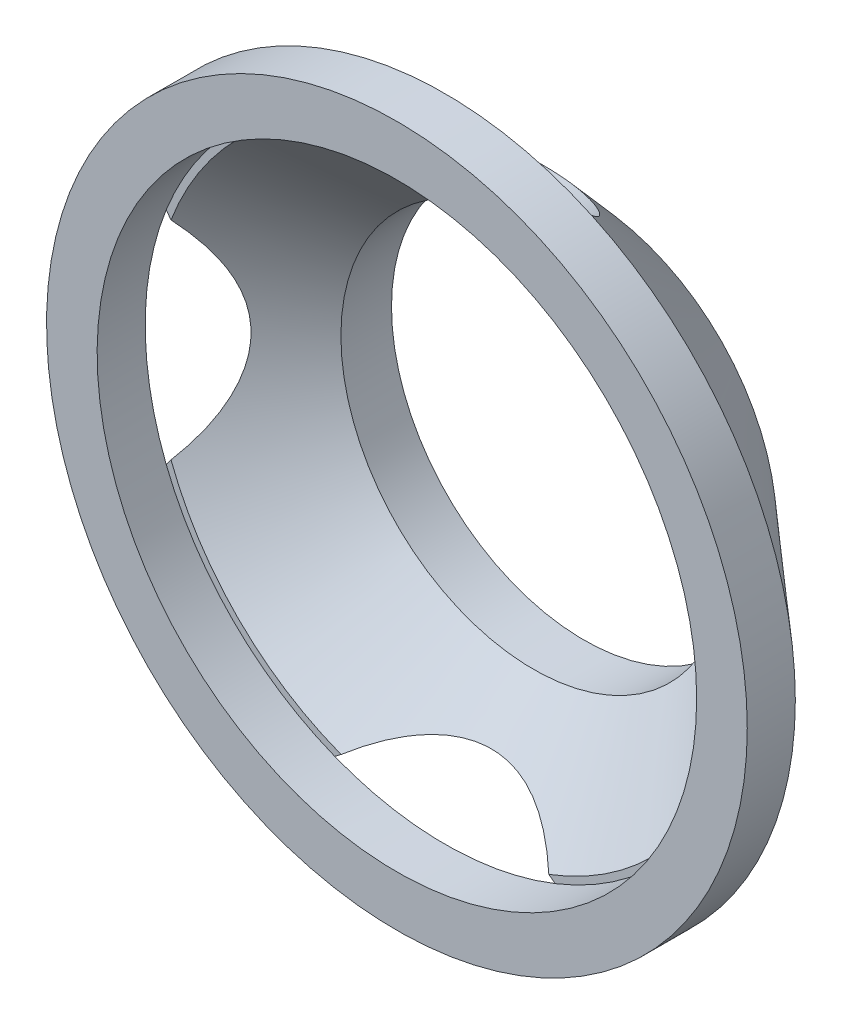
ISO-10303-21;
HEADER;
FILE_DESCRIPTION(('STEP AP214'),'2;1');
FILE_NAME('part.step','',(''),(''),'','','');
FILE_SCHEMA(('AUTOMOTIVE_DESIGN { 1 0 10303 214 1 1 1 1 }'));
ENDSEC;
DATA;
#1=APPLICATION_CONTEXT('core data for automotive mechanical design processes');
#2=APPLICATION_PROTOCOL_DEFINITION('international standard','automotive_design',2000,#1);
#3=PRODUCT_CONTEXT('',#1,'mechanical');
#4=PRODUCT('Part','Part','',(#3));
#5=PRODUCT_RELATED_PRODUCT_CATEGORY('part','',(#4));
#6=PRODUCT_DEFINITION_FORMATION('','',#4);
#7=PRODUCT_DEFINITION_CONTEXT('part definition',#1,'design');
#8=PRODUCT_DEFINITION('design','',#6,#7);
#9=PRODUCT_DEFINITION_SHAPE('','',#8);
#10=(LENGTH_UNIT() NAMED_UNIT(*) SI_UNIT(.MILLI.,.METRE.));
#11=(NAMED_UNIT(*) PLANE_ANGLE_UNIT() SI_UNIT($,.RADIAN.));
#12=(NAMED_UNIT(*) SI_UNIT($,.STERADIAN.) SOLID_ANGLE_UNIT());
#13=UNCERTAINTY_MEASURE_WITH_UNIT(LENGTH_MEASURE(1.E-05),#10,'distance_accuracy_value','');
#14=(GEOMETRIC_REPRESENTATION_CONTEXT(3) GLOBAL_UNCERTAINTY_ASSIGNED_CONTEXT((#13)) GLOBAL_UNIT_ASSIGNED_CONTEXT((#10,
#11,#12)) REPRESENTATION_CONTEXT('',''));
#15=CARTESIAN_POINT('',(0.,0.,0.));
#16=DIRECTION('',(0.,0.,1.));
#17=DIRECTION('',(1.,0.,0.));
#18=AXIS2_PLACEMENT_3D('',#15,#16,#17);
#19=CARTESIAN_POINT('',(-13.85,0.,0.));
#20=DIRECTION('',(0.,0.,1.));
#21=DIRECTION('',(1.,0.,0.));
#22=AXIS2_PLACEMENT_3D('',#19,#20,#21);
#23=PLANE('',#22);
#24=CARTESIAN_POINT('',(-16.5,0.,0.));
#25=DIRECTION('',(0.,0.,-1.));
#26=DIRECTION('',(-1.,0.,0.));
#27=AXIS2_PLACEMENT_3D('',#24,#25,#26);
#28=CIRCLE('',#27,7.);
#29=CARTESIAN_POINT('',(-11.0203787878788,4.35588697875315,0.));
#30=VERTEX_POINT('',#29);
#31=CARTESIAN_POINT('',(-10.8302321735977,4.10532980340105,0.));
#32=VERTEX_POINT('',#31);
#33=EDGE_CURVE('E240',#30,#32,#28,.T.);
#34=ORIENTED_EDGE('',*,*,#33,.T.);
#35=CARTESIAN_POINT('',(0.,0.,0.));
#36=DIRECTION('',(0.,0.,-1.));
#37=DIRECTION('',(-1.,0.,0.));
#38=AXIS2_PLACEMENT_3D('',#35,#36,#37);
#39=CIRCLE('',#38,11.5822131619446);
#40=CARTESIAN_POINT('',(-4.10532980340105,10.8302321735977,0.));
#41=VERTEX_POINT('',#40);
#42=EDGE_CURVE('E148',#32,#41,#39,.T.);
#43=ORIENTED_EDGE('',*,*,#42,.T.);
#44=CARTESIAN_POINT('',(0.,16.5,0.));
#45=DIRECTION('',(0.,0.,-1.));
#46=DIRECTION('',(-1.,0.,0.));
#47=AXIS2_PLACEMENT_3D('',#44,#45,#46);
#48=CIRCLE('',#47,7.);
#49=CARTESIAN_POINT('',(-4.35588697875316,11.0203787878788,0.));
#50=VERTEX_POINT('',#49);
#51=EDGE_CURVE('E242',#41,#50,#48,.T.);
#52=ORIENTED_EDGE('',*,*,#51,.T.);
#53=CARTESIAN_POINT('',(0.,0.,0.));
#54=DIRECTION('',(0.,0.,1.));
#55=DIRECTION('',(1.,0.,0.));
#56=AXIS2_PLACEMENT_3D('',#53,#54,#55);
#57=CIRCLE('',#56,11.85);
#58=EDGE_CURVE('E155',#50,#30,#57,.T.);
#59=ORIENTED_EDGE('',*,*,#58,.T.);
#60=EDGE_LOOP('',(#34,#43,#52,#59));
#61=FACE_BOUND('',#60,.T.);
#62=ADVANCED_FACE('F33',(#61),#23,.T.);
#63=CARTESIAN_POINT('',(0.,-16.5,0.));
#64=DIRECTION('',(0.,0.,-1.));
#65=DIRECTION('',(-1.,0.,0.));
#66=AXIS2_PLACEMENT_3D('',#63,#64,#65);
#67=CIRCLE('',#66,7.);
#68=CARTESIAN_POINT('',(4.10532980340104,-10.8302321735977,0.));
#69=VERTEX_POINT('',#68);
#70=CARTESIAN_POINT('',(4.35588697875315,-11.0203787878788,0.));
#71=VERTEX_POINT('',#70);
#72=EDGE_CURVE('E250',#69,#71,#67,.T.);
#73=ORIENTED_EDGE('',*,*,#72,.T.);
#74=CARTESIAN_POINT('',(4.35588697875316,11.0203787878788,0.));
#75=VERTEX_POINT('',#74);
#76=EDGE_CURVE('E146',#71,#75,#57,.T.);
#77=ORIENTED_EDGE('',*,*,#76,.T.);
#78=CARTESIAN_POINT('',(4.10532980340105,10.8302321735977,0.));
#79=VERTEX_POINT('',#78);
#80=EDGE_CURVE('E129',#75,#79,#48,.T.);
#81=ORIENTED_EDGE('',*,*,#80,.T.);
#82=EDGE_CURVE('E224',#79,#69,#39,.T.);
#83=ORIENTED_EDGE('',*,*,#82,.T.);
#84=EDGE_LOOP('',(#73,#77,#81,#83));
#85=FACE_BOUND('',#84,.T.);
#86=ADVANCED_FACE('F247',(#85),#23,.T.);
#87=CARTESIAN_POINT('',(0.,0.,1.9));
#88=DIRECTION('',(0.,0.,1.));
#89=DIRECTION('',(1.,0.,0.));
#90=AXIS2_PLACEMENT_3D('',#87,#88,#89);
#91=PLANE('',#90);
#92=CARTESIAN_POINT('',(0.,0.,1.9));
#93=DIRECTION('',(0.,0.,1.));
#94=DIRECTION('',(1.,0.,0.));
#95=AXIS2_PLACEMENT_3D('',#92,#93,#94);
#96=CIRCLE('',#95,13.85);
#97=CARTESIAN_POINT('',(13.85,0.,1.9));
#98=VERTEX_POINT('',#97);
#99=EDGE_CURVE('E138',#98,#98,#96,.T.);
#100=ORIENTED_EDGE('',*,*,#99,.T.);
#101=EDGE_LOOP('',(#100));
#102=FACE_BOUND('',#101,.T.);
#103=CARTESIAN_POINT('',(0.,0.,1.9));
#104=DIRECTION('',(0.,0.,1.));
#105=DIRECTION('',(1.,0.,0.));
#106=AXIS2_PLACEMENT_3D('',#103,#104,#105);
#107=CIRCLE('',#106,11.85);
#108=CARTESIAN_POINT('',(11.85,0.,1.9));
#109=VERTEX_POINT('',#108);
#110=EDGE_CURVE('E150',#109,#109,#107,.T.);
#111=ORIENTED_EDGE('',*,*,#110,.F.);
#112=EDGE_LOOP('',(#111));
#113=FACE_BOUND('',#112,.T.);
#114=ADVANCED_FACE('F279',(#102,#113),#91,.T.);
#115=CARTESIAN_POINT('',(0.,0.,1.9));
#116=DIRECTION('',(0.,0.,-1.));
#117=DIRECTION('',(-1.,0.,0.));
#118=AXIS2_PLACEMENT_3D('',#115,#116,#117);
#119=CYLINDRICAL_SURFACE('',#118,13.85);
#120=ORIENTED_EDGE('',*,*,#99,.F.);
#121=EDGE_LOOP('',(#120));
#122=FACE_BOUND('',#121,.T.);
#123=CARTESIAN_POINT('',(0.,0.,0.));
#124=DIRECTION('',(0.,0.,-1.));
#125=DIRECTION('',(-1.,0.,0.));
#126=AXIS2_PLACEMENT_3D('',#123,#124,#125);
#127=CIRCLE('',#126,13.85);
#128=CARTESIAN_POINT('',(-12.5779545454546,5.79806514731245,0.));
#129=VERTEX_POINT('',#128);
#130=CARTESIAN_POINT('',(-5.79806514731245,12.5779545454545,0.));
#131=VERTEX_POINT('',#130);
#132=EDGE_CURVE('E121',#129,#131,#127,.T.);
#133=ORIENTED_EDGE('',*,*,#132,.F.);
#134=CARTESIAN_POINT('',(-12.5779545454545,-5.79806514731246,0.));
#135=VERTEX_POINT('',#134);
#136=EDGE_CURVE('E147',#135,#129,#127,.T.);
#137=ORIENTED_EDGE('',*,*,#136,.F.);
#138=CARTESIAN_POINT('',(-5.79806514731245,-12.5779545454545,0.));
#139=VERTEX_POINT('',#138);
#140=EDGE_CURVE('E143',#139,#135,#127,.T.);
#141=ORIENTED_EDGE('',*,*,#140,.F.);
#142=CARTESIAN_POINT('',(5.79806514731244,-12.5779545454545,0.));
#143=VERTEX_POINT('',#142);
#144=EDGE_CURVE('E142',#143,#139,#127,.T.);
#145=ORIENTED_EDGE('',*,*,#144,.F.);
#146=CARTESIAN_POINT('',(5.79806514731245,12.5779545454545,0.));
#147=VERTEX_POINT('',#146);
#148=EDGE_CURVE('E122',#147,#143,#127,.T.);
#149=ORIENTED_EDGE('',*,*,#148,.F.);
#150=EDGE_CURVE('E109',#131,#147,#127,.T.);
#151=ORIENTED_EDGE('',*,*,#150,.F.);
#152=EDGE_LOOP('',(#133,#137,#141,#145,#149,#151));
#153=FACE_BOUND('',#152,.T.);
#154=ADVANCED_FACE('F35',(#122,#153),#119,.T.);
#155=CARTESIAN_POINT('',(0.,0.,1.9));
#156=DIRECTION('',(0.,0.,-1.));
#157=DIRECTION('',(-1.,0.,0.));
#158=AXIS2_PLACEMENT_3D('',#155,#156,#157);
#159=CYLINDRICAL_SURFACE('',#158,11.85);
#160=ORIENTED_EDGE('',*,*,#110,.T.);
#161=EDGE_LOOP('',(#160));
#162=FACE_BOUND('',#161,.T.);
#163=EDGE_CURVE('E153',#75,#50,#57,.T.);
#164=ORIENTED_EDGE('',*,*,#163,.F.);
#165=ORIENTED_EDGE('',*,*,#76,.F.);
#166=CARTESIAN_POINT('',(0.,0.,0.));
#167=DIRECTION('',(0.,0.,-1.));
#168=DIRECTION('',(-1.,0.,0.));
#169=AXIS2_PLACEMENT_3D('',#166,#167,#168);
#170=CIRCLE('',#169,11.85);
#171=CARTESIAN_POINT('',(-4.35588697875315,-11.0203787878788,0.));
#172=VERTEX_POINT('',#171);
#173=EDGE_CURVE('E185',#71,#172,#170,.T.);
#174=ORIENTED_EDGE('',*,*,#173,.T.);
#175=CARTESIAN_POINT('',(-11.0203787878788,-4.35588697875316,0.));
#176=VERTEX_POINT('',#175);
#177=EDGE_CURVE('E233',#176,#172,#57,.T.);
#178=ORIENTED_EDGE('',*,*,#177,.F.);
#179=CARTESIAN_POINT('',(0.,0.,0.));
#180=DIRECTION('',(0.,0.,-1.));
#181=DIRECTION('',(-1.,0.,0.));
#182=AXIS2_PLACEMENT_3D('',#179,#180,#181);
#183=CIRCLE('',#182,11.85);
#184=EDGE_CURVE('E201',#176,#30,#183,.T.);
#185=ORIENTED_EDGE('',*,*,#184,.T.);
#186=ORIENTED_EDGE('',*,*,#58,.F.);
#187=EDGE_LOOP('',(#164,#165,#174,#178,#185,#186));
#188=FACE_BOUND('',#187,.T.);
#189=ADVANCED_FACE('F192',(#162,#188),#159,.F.);
#190=CARTESIAN_POINT('',(0.,0.,0.));
#191=DIRECTION('',(0.,0.,1.));
#192=DIRECTION('',(1.,0.,0.));
#193=AXIS2_PLACEMENT_3D('',#190,#191,#192);
#194=CONICAL_SURFACE('',#193,11.5822131619446,0.848062078981482);
#195=CARTESIAN_POINT('',(-10.8303913629777,-4.10554964688071,0.000200000000008288));
#196=CARTESIAN_POINT('',(-10.7428653074275,-3.98463725873179,-0.109738211886608));
#197=CARTESIAN_POINT('',(-10.6582967673889,-3.8597495739036,-0.217786469228411));
#198=CARTESIAN_POINT('',(-10.495535101213,-3.60136972234227,-0.428972990414658));
#199=CARTESIAN_POINT('',(-10.4173565934581,-3.46785901172065,-0.532099783104051));
#200=CARTESIAN_POINT('',(-10.2670476250824,-3.18992634298651,-0.733396180731003));
#201=CARTESIAN_POINT('',(-10.1950328435237,-3.04536484368291,-0.831461135383984));
#202=CARTESIAN_POINT('',(-10.0594588147681,-2.74704546130788,-1.01875633497018));
#203=CARTESIAN_POINT('',(-9.99589204257826,-2.59329594180298,-1.10799442398942));
#204=CARTESIAN_POINT('',(-9.85570992234759,-2.21542792290558,-1.30738303448638));
#205=CARTESIAN_POINT('',(-9.78342132531399,-1.98691121388523,-1.4124530253732));
#206=CARTESIAN_POINT('',(-9.66128165383431,-1.51364967673713,-1.5923612912755));
#207=CARTESIAN_POINT('',(-9.61131232882562,-1.26899845020886,-1.66735867332574));
#208=CARTESIAN_POINT('',(-9.54309293275292,-0.80488107092919,-1.77045415413124));
#209=CARTESIAN_POINT('',(-9.52119937032346,-0.587170515528514,-1.80391416273381));
#210=CARTESIAN_POINT('',(-9.49811645470526,-0.147996150381557,-1.83920368564999));
#211=CARTESIAN_POINT('',(-9.49692693754627,0.0734676296263277,-1.84103345046631));
#212=CARTESIAN_POINT('',(-9.51536579109055,0.513086097947436,-1.81282651914419));
#213=CARTESIAN_POINT('',(-9.53496481080737,0.731245011804505,-1.78283475127611));
#214=CARTESIAN_POINT('',(-9.59323997850695,1.15907188030378,-1.69460370853525));
#215=CARTESIAN_POINT('',(-9.63193392437386,1.3687317155062,-1.63633808117964));
#216=CARTESIAN_POINT('',(-9.74644890883376,1.86544435392723,-1.46642060499555));
#217=CARTESIAN_POINT('',(-9.83110513868568,2.14627948671866,-1.34256590903544));
#218=CARTESIAN_POINT('',(-9.9783405674588,2.54724124327396,-1.13287546010988));
#219=CARTESIAN_POINT('',(-10.0309345839094,2.67778217267592,-1.0588014269083));
#220=CARTESIAN_POINT('',(-10.1422259877997,2.93222587546133,-0.904116478490042));
#221=CARTESIAN_POINT('',(-10.2009220144973,3.05613011952045,-0.823507021545056));
#222=CARTESIAN_POINT('',(-10.3476807689904,3.34429853902246,-0.624718212169773));
#223=CARTESIAN_POINT('',(-10.4383026372547,3.50557344813174,-0.504095165188557));
#224=CARTESIAN_POINT('',(-10.58083826559,3.73787027526537,-0.318099019557759));
#225=CARTESIAN_POINT('',(-10.6292252582686,3.81339096743084,-0.255540609845712));
#226=CARTESIAN_POINT('',(-10.7281898930485,3.96158286172963,-0.128819323997568));
#227=CARTESIAN_POINT('',(-10.7787673117162,4.0342543530608,-0.0646566117887708));
#228=CARTESIAN_POINT('',(-10.8303913629777,4.10554964688069,0.000199999999999755));
#229=B_SPLINE_CURVE_WITH_KNOTS('',3,(#195,#196,#197,#198,#199,#200,#201,#202,#203,#204,#205,
#206,#207,#208,#209,#210,#211,#212,#213,#214,#215,#216,#217,#218,#219,#220,#221,#222,#223,#224,
#225,#226,#227,#228),.UNSPECIFIED.,.F.,.F.,(4,2,2,2,2,2,2,2,2,2,2,2,2,2,2,2,4),(0.,
0.556184772155327,1.11360824321816,1.67987846638666,2.24564085926135,3.02808722183656,
3.80633742292793,4.46738809269741,5.12843352712761,5.7885468833841,6.44927667955571,
7.39874457506992,7.87561459511292,8.35237850081107,9.01409158086126,9.34209710800027,
9.67006925547179),.UNSPECIFIED.);
#230=CARTESIAN_POINT('',(-10.8302321735977,-4.10532980340106,0.));
#231=VERTEX_POINT('',#230);
#232=EDGE_CURVE('E215',#231,#32,#229,.T.);
#233=ORIENTED_EDGE('',*,*,#232,.F.);
#234=CARTESIAN_POINT('',(-4.10532980340105,-10.8302321735977,0.));
#235=VERTEX_POINT('',#234);
#236=EDGE_CURVE('E220',#235,#231,#39,.T.);
#237=ORIENTED_EDGE('',*,*,#236,.F.);
#238=CARTESIAN_POINT('',(4.10554964688068,-10.8303913629777,0.000199999999998952));
#239=CARTESIAN_POINT('',(3.98463725873176,-10.7428653074275,-0.109738211886616));
#240=CARTESIAN_POINT('',(3.85974957390358,-10.6582967673889,-0.217786469228418));
#241=CARTESIAN_POINT('',(3.60136972234224,-10.495535101213,-0.428972990414663));
#242=CARTESIAN_POINT('',(3.46785901172062,-10.4173565934581,-0.532099783104055));
#243=CARTESIAN_POINT('',(3.18992634298649,-10.2670476250824,-0.733396180731004));
#244=CARTESIAN_POINT('',(3.04536484368289,-10.1950328435237,-0.831461135383984));
#245=CARTESIAN_POINT('',(2.74704546130786,-10.0594588147681,-1.01875633497017));
#246=CARTESIAN_POINT('',(2.59329594180296,-9.99589204257827,-1.10799442398942));
#247=CARTESIAN_POINT('',(2.21542792290556,-9.8557099223476,-1.30738303448638));
#248=CARTESIAN_POINT('',(1.98691121388521,-9.78342132531399,-1.4124530253732));
#249=CARTESIAN_POINT('',(1.51364967673711,-9.66128165383432,-1.5923612912755));
#250=CARTESIAN_POINT('',(1.26899845020884,-9.61131232882562,-1.66735867332574));
#251=CARTESIAN_POINT('',(0.80488107092917,-9.54309293275293,-1.77045415413123));
#252=CARTESIAN_POINT('',(0.587170515528495,-9.52119937032347,-1.80391416273381));
#253=CARTESIAN_POINT('',(0.147996150381538,-9.49811645470527,-1.83920368564999));
#254=CARTESIAN_POINT('',(-0.0734676296263471,-9.49692693754627,-1.8410334504663));
#255=CARTESIAN_POINT('',(-0.513086097947455,-9.51536579109056,-1.81282651914418));
#256=CARTESIAN_POINT('',(-0.731245011804523,-9.53496481080738,-1.7828347512761));
#257=CARTESIAN_POINT('',(-1.1590718803038,-9.59323997850696,-1.69460370853524));
#258=CARTESIAN_POINT('',(-1.36873171550622,-9.63193392437387,-1.63633808117963));
#259=CARTESIAN_POINT('',(-1.86544435392725,-9.74644890883377,-1.46642060499554));
#260=CARTESIAN_POINT('',(-2.14627948671868,-9.83110513868569,-1.34256590903543));
#261=CARTESIAN_POINT('',(-2.54724124327398,-9.97834056745881,-1.13287546010986));
#262=CARTESIAN_POINT('',(-2.67778217267594,-10.0309345839095,-1.05880142690828));
#263=CARTESIAN_POINT('',(-2.93222587546135,-10.1422259877998,-0.904116478490028));
#264=CARTESIAN_POINT('',(-3.05613011952047,-10.2009220144973,-0.823507021545041));
#265=CARTESIAN_POINT('',(-3.34429853902248,-10.3476807689904,-0.624718212169759));
#266=CARTESIAN_POINT('',(-3.50557344813176,-10.4383026372547,-0.504095165188545));
#267=CARTESIAN_POINT('',(-3.73787027526539,-10.58083826559,-0.318099019557748));
#268=CARTESIAN_POINT('',(-3.81339096743085,-10.6292252582686,-0.2555406098457));
#269=CARTESIAN_POINT('',(-3.96158286172964,-10.7281898930485,-0.128819323997557));
#270=CARTESIAN_POINT('',(-4.03425435306081,-10.7787673117162,-0.0646566117887604));
#271=CARTESIAN_POINT('',(-4.1055496468807,-10.8303913629777,0.000200000000008698));
#272=B_SPLINE_CURVE_WITH_KNOTS('',3,(#238,#239,#240,#241,#242,#243,#244,#245,#246,#247,#248,
#249,#250,#251,#252,#253,#254,#255,#256,#257,#258,#259,#260,#261,#262,#263,#264,#265,#266,#267,
#268,#269,#270,#271),.UNSPECIFIED.,.F.,.F.,(4,2,2,2,2,2,2,2,2,2,2,2,2,2,2,2,4),(0.,
0.556184772155323,1.11360824321815,1.67987846638665,2.24564085926134,3.02808722183655,
3.80633742292791,4.46738809269739,5.1284335271276,5.78854688338409,6.44927667955569,
7.3987445750699,7.87561459511291,8.35237850081106,9.01409158086124,9.34209710800025,
9.67006925547176),.UNSPECIFIED.);
#273=EDGE_CURVE('E61',#69,#235,#272,.T.);
#274=ORIENTED_EDGE('',*,*,#273,.F.);
#275=ORIENTED_EDGE('',*,*,#82,.F.);
#276=CARTESIAN_POINT('',(-4.10554964688071,10.8303913629777,0.000200000000008773));
#277=CARTESIAN_POINT('',(-3.98463725873178,10.7428653074275,-0.109738211886607));
#278=CARTESIAN_POINT('',(-3.8597495739036,10.6582967673889,-0.217786469228411));
#279=CARTESIAN_POINT('',(-3.60136972234226,10.495535101213,-0.428972990414658));
#280=CARTESIAN_POINT('',(-3.46785901172064,10.4173565934581,-0.532099783104052));
#281=CARTESIAN_POINT('',(-3.18992634298651,10.2670476250824,-0.733396180731004));
#282=CARTESIAN_POINT('',(-3.04536484368291,10.1950328435237,-0.831461135383985));
#283=CARTESIAN_POINT('',(-2.74704546130788,10.0594588147681,-1.01875633497018));
#284=CARTESIAN_POINT('',(-2.59329594180297,9.99589204257826,-1.10799442398942));
#285=CARTESIAN_POINT('',(-2.21542792290558,9.85570992234759,-1.30738303448638));
#286=CARTESIAN_POINT('',(-1.98691121388523,9.78342132531398,-1.4124530253732));
#287=CARTESIAN_POINT('',(-1.51364967673713,9.66128165383431,-1.59236129127551));
#288=CARTESIAN_POINT('',(-1.26899845020886,9.61131232882561,-1.66735867332574));
#289=CARTESIAN_POINT('',(-0.804881070929187,9.54309293275291,-1.77045415413124));
#290=CARTESIAN_POINT('',(-0.587170515528511,9.52119937032346,-1.80391416273381));
#291=CARTESIAN_POINT('',(-0.147996150381554,9.49811645470526,-1.83920368564999));
#292=CARTESIAN_POINT('',(0.0734676296263313,9.49692693754626,-1.8410334504663));
#293=CARTESIAN_POINT('',(0.513086097947439,9.51536579109055,-1.81282651914419));
#294=CARTESIAN_POINT('',(0.731245011804507,9.53496481080737,-1.78283475127611));
#295=CARTESIAN_POINT('',(1.15907188030378,9.59323997850695,-1.69460370853525));
#296=CARTESIAN_POINT('',(1.3687317155062,9.63193392437385,-1.63633808117964));
#297=CARTESIAN_POINT('',(1.86544435392723,9.74644890883375,-1.46642060499555));
#298=CARTESIAN_POINT('',(2.14627948671866,9.83110513868568,-1.34256590903544));
#299=CARTESIAN_POINT('',(2.54724124327396,9.9783405674588,-1.13287546010988));
#300=CARTESIAN_POINT('',(2.67778217267592,10.0309345839094,-1.0588014269083));
#301=CARTESIAN_POINT('',(2.93222587546134,10.1422259877997,-0.904116478490044));
#302=CARTESIAN_POINT('',(3.05613011952045,10.2009220144973,-0.823507021545057));
#303=CARTESIAN_POINT('',(3.34429853902246,10.3476807689904,-0.624718212169775));
#304=CARTESIAN_POINT('',(3.50557344813174,10.4383026372547,-0.504095165188559));
#305=CARTESIAN_POINT('',(3.73787027526538,10.58083826559,-0.318099019557759));
#306=CARTESIAN_POINT('',(3.81339096743084,10.6292252582685,-0.255540609845711));
#307=CARTESIAN_POINT('',(3.96158286172963,10.7281898930485,-0.128819323997566));
#308=CARTESIAN_POINT('',(4.0342543530608,10.7787673117162,-0.0646566117887697));
#309=CARTESIAN_POINT('',(4.10554964688069,10.8303913629777,0.000199999999998966));
#310=B_SPLINE_CURVE_WITH_KNOTS('',3,(#276,#277,#278,#279,#280,#281,#282,#283,#284,#285,#286,
#287,#288,#289,#290,#291,#292,#293,#294,#295,#296,#297,#298,#299,#300,#301,#302,#303,#304,#305,
#306,#307,#308,#309),.UNSPECIFIED.,.F.,.F.,(4,2,2,2,2,2,2,2,2,2,2,2,2,2,2,2,4),(0.,
0.556184772155328,1.11360824321816,1.67987846638666,2.24564085926135,3.02808722183657,
3.80633742292793,4.46738809269741,5.12843352712762,5.7885468833841,6.44927667955571,
7.39874457506992,7.87561459511292,8.35237850081107,9.01409158086126,9.34209710800027,
9.67006925547179),.UNSPECIFIED.);
#311=EDGE_CURVE('E178',#41,#79,#310,.T.);
#312=ORIENTED_EDGE('',*,*,#311,.F.);
#313=ORIENTED_EDGE('',*,*,#42,.F.);
#314=EDGE_LOOP('',(#233,#237,#274,#275,#312,#313));
#315=FACE_BOUND('',#314,.T.);
#316=CARTESIAN_POINT('',(0.,0.,-3.5));
#317=DIRECTION('',(0.,0.,1.));
#318=DIRECTION('',(1.,0.,0.));
#319=AXIS2_PLACEMENT_3D('',#316,#317,#318);
#320=CIRCLE('',#319,7.61358619534771);
#321=CARTESIAN_POINT('',(7.61358619534772,0.,-3.5));
#322=VERTEX_POINT('',#321);
#323=EDGE_CURVE('E186',#322,#322,#320,.T.);
#324=ORIENTED_EDGE('',*,*,#323,.F.);
#325=EDGE_LOOP('',(#324));
#326=FACE_BOUND('',#325,.T.);
#327=ADVANCED_FACE('F188',(#315,#326),#194,.F.);
#328=EDGE_CURVE('E263',#231,#176,#28,.T.);
#329=ORIENTED_EDGE('',*,*,#328,.T.);
#330=ORIENTED_EDGE('',*,*,#177,.T.);
#331=EDGE_CURVE('E257',#172,#235,#67,.T.);
#332=ORIENTED_EDGE('',*,*,#331,.T.);
#333=ORIENTED_EDGE('',*,*,#236,.T.);
#334=EDGE_LOOP('',(#329,#330,#332,#333));
#335=FACE_BOUND('',#334,.T.);
#336=ADVANCED_FACE('F191',(#335),#23,.T.);
#337=CARTESIAN_POINT('',(0.,0.,-5.5));
#338=DIRECTION('',(0.,0.,1.));
#339=DIRECTION('',(1.,0.,0.));
#340=AXIS2_PLACEMENT_3D('',#337,#338,#339);
#341=CONICAL_SURFACE('',#340,7.61358619534771,0.848062078981484);
#342=CARTESIAN_POINT('',(-12.5781449036658,5.79819390874064,0.000200000000000945));
#343=CARTESIAN_POINT('',(-12.486235006262,5.73602285340114,-0.0963628830387125));
#344=CARTESIAN_POINT('',(-12.3956432025172,5.67156602141624,-0.192689572384545));
#345=CARTESIAN_POINT('',(-12.2171986959542,5.53805390897669,-0.38471275318473));
#346=CARTESIAN_POINT('',(-12.1293462679874,5.46899816926326,-0.480409180647739));
#347=CARTESIAN_POINT('',(-11.8697275225389,5.25462081110305,-0.766675647327349));
#348=CARTESIAN_POINT('',(-11.702275203986,5.10234218976458,-0.956028014787507));
#349=CARTESIAN_POINT('',(-11.3780556200588,4.77693777274827,-1.33182994829034));
#350=CARTESIAN_POINT('',(-11.2214515509764,4.60357122497156,-1.51821185619628));
#351=CARTESIAN_POINT('',(-10.9228773514248,4.23692678474233,-1.88265704837652));
#352=CARTESIAN_POINT('',(-10.7808918273374,4.04367027479311,-2.06072897288487));
#353=CARTESIAN_POINT('',(-10.5736657988014,3.7278005641777,-2.32714305805276));
#354=CARTESIAN_POINT('',(-10.5026535709253,3.61255551682603,-2.41978820267783));
#355=CARTESIAN_POINT('',(-10.3660383153672,3.37538863375271,-2.60045261273798));
#356=CARTESIAN_POINT('',(-10.3004352802599,3.25346680719665,-2.68847188452292));
#357=CARTESIAN_POINT('',(-10.1753393032693,3.00303204469271,-2.85851848736465));
#358=CARTESIAN_POINT('',(-10.1158305470458,2.87453753603234,-2.94056115880925));
#359=CARTESIAN_POINT('',(-10.0034021435128,2.61051793500901,-3.09746535958992));
#360=CARTESIAN_POINT('',(-9.95048119555389,2.47499423794757,-3.17232830576716));
#361=CARTESIAN_POINT('',(-9.82248110358798,2.11339084495548,-3.3554282717573));
#362=CARTESIAN_POINT('',(-9.75309731101039,1.88165937159511,-3.4568227398823));
#363=CARTESIAN_POINT('',(-9.63730153426482,1.4014424226211,-3.6281681589935));
#364=CARTESIAN_POINT('',(-9.59084950577305,1.15298701958143,-3.69817390241178));
#365=CARTESIAN_POINT('',(-9.53023255882183,0.684753349088871,-3.79005113085287));
#366=CARTESIAN_POINT('',(-9.51211999571337,0.466663303356997,-3.81778893548724));
#367=CARTESIAN_POINT('',(-9.49662307559941,0.0280382488563414,-3.8415030090986));
#368=CARTESIAN_POINT('',(-9.49922969965752,-0.192495654373822,-3.83749309766669));
#369=CARTESIAN_POINT('',(-9.52489141854819,-0.628972215247507,-3.79827880082942));
#370=CARTESIAN_POINT('',(-9.54790241627497,-0.844923746160339,-3.76314168643002));
#371=CARTESIAN_POINT('',(-9.61241369505486,-1.26769315334735,-3.66574626099444));
#372=CARTESIAN_POINT('',(-9.65393199262882,-1.47450191314249,-3.60346152355471));
#373=CARTESIAN_POINT('',(-9.77718499553432,-1.97450574708014,-3.42134463400398));
#374=CARTESIAN_POINT('',(-9.8686575748106,-2.26047593545798,-3.28826583553006));
#375=CARTESIAN_POINT('',(-10.0266489566671,-2.66779363506722,-3.06482806300159));
#376=CARTESIAN_POINT('',(-10.0829066475152,-2.80019689708454,-2.9862021220254));
#377=CARTESIAN_POINT('',(-10.201693292381,-3.05801113356408,-2.82246731849627));
#378=CARTESIAN_POINT('',(-10.2642210074773,-3.18342348180124,-2.737359737475));
#379=CARTESIAN_POINT('',(-10.4337298788672,-3.49986742504996,-2.50993159106126));
#380=CARTESIAN_POINT('',(-10.5450773639746,-3.68569121174616,-2.3636216621687));
#381=CARTESIAN_POINT('',(-10.780368372246,-4.04119579199509,-2.06171599077692));
#382=CARTESIAN_POINT('',(-10.9043201161067,-4.2108659083903,-1.90611421564684));
#383=CARTESIAN_POINT('',(-11.1634796695213,-4.53481865438792,-1.58837308574734));
#384=CARTESIAN_POINT('',(-11.2986900651465,-4.68909773073702,-1.42623223341037));
#385=CARTESIAN_POINT('',(-11.5792548926102,-4.98271708057912,-1.09749277157147));
#386=CARTESIAN_POINT('',(-11.7246045892014,-5.12206425145845,-0.930896265064902));
#387=CARTESIAN_POINT('',(-11.9870615756224,-5.35311400616017,-0.636775420366574));
#388=CARTESIAN_POINT('',(-12.1021249130316,-5.44800851077459,-0.509915430537878));
#389=CARTESIAN_POINT('',(-12.3367513536111,-5.62931792765571,-0.255430695109389));
#390=CARTESIAN_POINT('',(-12.456295895877,-5.71576340341476,-0.127810623314214));
#391=CARTESIAN_POINT('',(-12.5781449036658,-5.79819390874065,0.000200000000000464));
#392=B_SPLINE_CURVE_WITH_KNOTS('',3,(#342,#343,#344,#345,#346,#347,#348,#349,#350,#351,#352,
#353,#354,#355,#356,#357,#358,#359,#360,#361,#362,#363,#364,#365,#366,#367,#368,#369,#370,#371,
#372,#373,#374,#375,#376,#377,#378,#379,#380,#381,#382,#383,#384,#385,#386,#387,#388,#389,#390,
#391),.UNSPECIFIED.,.F.,.F.,(4,2,2,2,2,2,2,2,2,2,2,2,2,2,2,2,2,2,2,2,2,2,2,2,4),(0.,
0.441235367255708,0.882514863679338,1.76687184839107,2.66248903021792,3.5571532504122,
4.04901770700741,4.54088148840917,5.03143472015057,5.52189094645833,6.30589271558834,
7.08852054490292,7.74723027794974,8.40565329435564,9.06265681232274,9.72030131281744,
10.6996217885685,11.1912032602975,11.6826877889937,12.465734329264,13.2492949010695,
14.0330359530242,14.8164134022363,15.403590909848,15.9885589812723),.UNSPECIFIED.);
#393=EDGE_CURVE('E11',#129,#135,#392,.T.);
#394=ORIENTED_EDGE('',*,*,#393,.F.);
#395=ORIENTED_EDGE('',*,*,#132,.T.);
#396=CARTESIAN_POINT('',(5.79819390874064,12.5781449036658,0.000200000000001638));
#397=CARTESIAN_POINT('',(5.73602285340114,12.486235006262,-0.0963628830387109));
#398=CARTESIAN_POINT('',(5.67156602141624,12.3956432025171,-0.192689572384543));
#399=CARTESIAN_POINT('',(5.5380539089767,12.2171986959542,-0.38471275318473));
#400=CARTESIAN_POINT('',(5.46899816926326,12.1293462679873,-0.480409180647739));
#401=CARTESIAN_POINT('',(5.25462081110306,11.8697275225389,-0.76667564732735));
#402=CARTESIAN_POINT('',(5.10234218976458,11.702275203986,-0.956028014787507));
#403=CARTESIAN_POINT('',(4.77693777274827,11.3780556200588,-1.33182994829034));
#404=CARTESIAN_POINT('',(4.60357122497156,11.2214515509764,-1.51821185619628));
#405=CARTESIAN_POINT('',(4.23692678474233,10.9228773514248,-1.88265704837653));
#406=CARTESIAN_POINT('',(4.04367027479311,10.7808918273374,-2.06072897288487));
#407=CARTESIAN_POINT('',(3.7278005641777,10.5736657988014,-2.32714305805276));
#408=CARTESIAN_POINT('',(3.61255551682604,10.5026535709253,-2.41978820267783));
#409=CARTESIAN_POINT('',(3.37538863375272,10.3660383153671,-2.60045261273798));
#410=CARTESIAN_POINT('',(3.25346680719666,10.3004352802599,-2.68847188452292));
#411=CARTESIAN_POINT('',(3.00303204469272,10.1753393032693,-2.85851848736465));
#412=CARTESIAN_POINT('',(2.87453753603235,10.1158305470458,-2.94056115880924));
#413=CARTESIAN_POINT('',(2.61051793500901,10.0034021435128,-3.09746535958991));
#414=CARTESIAN_POINT('',(2.47499423794758,9.95048119555388,-3.17232830576716));
#415=CARTESIAN_POINT('',(2.11339084495548,9.82248110358797,-3.3554282717573));
#416=CARTESIAN_POINT('',(1.88165937159511,9.75309731101039,-3.4568227398823));
#417=CARTESIAN_POINT('',(1.40144242262111,9.63730153426482,-3.62816815899351));
#418=CARTESIAN_POINT('',(1.15298701958143,9.59084950577304,-3.69817390241178));
#419=CARTESIAN_POINT('',(0.684753349088877,9.53023255882183,-3.79005113085287));
#420=CARTESIAN_POINT('',(0.466663303357002,9.51211999571336,-3.81778893548724));
#421=CARTESIAN_POINT('',(0.0280382488563463,9.49662307559941,-3.8415030090986));
#422=CARTESIAN_POINT('',(-0.192495654373818,9.49922969965751,-3.83749309766669));
#423=CARTESIAN_POINT('',(-0.628972215247503,9.52489141854818,-3.79827880082942));
#424=CARTESIAN_POINT('',(-0.844923746160335,9.54790241627497,-3.76314168643002));
#425=CARTESIAN_POINT('',(-1.26769315334735,9.61241369505486,-3.66574626099444));
#426=CARTESIAN_POINT('',(-1.47450191314248,9.65393199262882,-3.60346152355471));
#427=CARTESIAN_POINT('',(-1.97450574708013,9.77718499553432,-3.42134463400398));
#428=CARTESIAN_POINT('',(-2.26047593545798,9.8686575748106,-3.28826583553006));
#429=CARTESIAN_POINT('',(-2.66779363506721,10.0266489566671,-3.06482806300159));
#430=CARTESIAN_POINT('',(-2.80019689708453,10.0829066475152,-2.9862021220254));
#431=CARTESIAN_POINT('',(-3.05801113356407,10.201693292381,-2.82246731849627));
#432=CARTESIAN_POINT('',(-3.18342348180123,10.2642210074773,-2.73735973747501));
#433=CARTESIAN_POINT('',(-3.49986742504995,10.4337298788672,-2.50993159106126));
#434=CARTESIAN_POINT('',(-3.68569121174615,10.5450773639746,-2.3636216621687));
#435=CARTESIAN_POINT('',(-4.04119579199508,10.780368372246,-2.06171599077692));
#436=CARTESIAN_POINT('',(-4.21086590839029,10.9043201161067,-1.90611421564684));
#437=CARTESIAN_POINT('',(-4.53481865438791,11.1634796695212,-1.58837308574734));
#438=CARTESIAN_POINT('',(-4.68909773073701,11.2986900651465,-1.42623223341037));
#439=CARTESIAN_POINT('',(-4.98271708057911,11.5792548926102,-1.09749277157147));
#440=CARTESIAN_POINT('',(-5.12206425145845,11.7246045892014,-0.930896265064906));
#441=CARTESIAN_POINT('',(-5.35311400616016,11.9870615756224,-0.636775420366576));
#442=CARTESIAN_POINT('',(-5.44800851077458,12.1021249130316,-0.509915430537879));
#443=CARTESIAN_POINT('',(-5.6293179276557,12.3367513536111,-0.255430695109389));
#444=CARTESIAN_POINT('',(-5.71576340341475,12.456295895877,-0.127810623314214));
#445=CARTESIAN_POINT('',(-5.79819390874065,12.5781449036658,0.000200000000000828));
#446=B_SPLINE_CURVE_WITH_KNOTS('',3,(#396,#397,#398,#399,#400,#401,#402,#403,#404,#405,#406,
#407,#408,#409,#410,#411,#412,#413,#414,#415,#416,#417,#418,#419,#420,#421,#422,#423,#424,#425,
#426,#427,#428,#429,#430,#431,#432,#433,#434,#435,#436,#437,#438,#439,#440,#441,#442,#443,#444,
#445),.UNSPECIFIED.,.F.,.F.,(4,2,2,2,2,2,2,2,2,2,2,2,2,2,2,2,2,2,2,2,2,2,2,2,4),(0.,
0.441235367255707,0.882514863679336,1.76687184839107,2.66248903021792,3.5571532504122,
4.0490177070074,4.54088148840917,5.03143472015057,5.52189094645833,6.30589271558834,
7.08852054490291,7.74723027794974,8.40565329435563,9.06265681232274,9.72030131281744,
10.6996217885685,11.1912032602975,11.6826877889937,12.465734329264,13.2492949010695,
14.0330359530242,14.8164134022363,15.403590909848,15.9885589812723),.UNSPECIFIED.);
#447=EDGE_CURVE('E127',#147,#131,#446,.T.);
#448=ORIENTED_EDGE('',*,*,#447,.F.);
#449=ORIENTED_EDGE('',*,*,#148,.T.);
#450=CARTESIAN_POINT('',(-5.79819390874064,-12.5781449036658,0.000200000000000945));
#451=CARTESIAN_POINT('',(-5.73602285340115,-12.486235006262,-0.0963628830387112));
#452=CARTESIAN_POINT('',(-5.67156602141624,-12.3956432025172,-0.192689572384544));
#453=CARTESIAN_POINT('',(-5.5380539089767,-12.2171986959542,-0.38471275318473));
#454=CARTESIAN_POINT('',(-5.46899816926326,-12.1293462679874,-0.480409180647739));
#455=CARTESIAN_POINT('',(-5.25462081110306,-11.8697275225389,-0.766675647327349));
#456=CARTESIAN_POINT('',(-5.10234218976458,-11.702275203986,-0.956028014787507));
#457=CARTESIAN_POINT('',(-4.77693777274827,-11.3780556200588,-1.33182994829034));
#458=CARTESIAN_POINT('',(-4.60357122497156,-11.2214515509764,-1.51821185619628));
#459=CARTESIAN_POINT('',(-4.23692678474233,-10.9228773514248,-1.88265704837652));
#460=CARTESIAN_POINT('',(-4.04367027479311,-10.7808918273374,-2.06072897288487));
#461=CARTESIAN_POINT('',(-3.7278005641777,-10.5736657988014,-2.32714305805276));
#462=CARTESIAN_POINT('',(-3.61255551682604,-10.5026535709253,-2.41978820267783));
#463=CARTESIAN_POINT('',(-3.37538863375272,-10.3660383153672,-2.60045261273798));
#464=CARTESIAN_POINT('',(-3.25346680719666,-10.3004352802599,-2.68847188452292));
#465=CARTESIAN_POINT('',(-3.00303204469271,-10.1753393032693,-2.85851848736464));
#466=CARTESIAN_POINT('',(-2.87453753603234,-10.1158305470458,-2.94056115880924));
#467=CARTESIAN_POINT('',(-2.61051793500901,-10.0034021435128,-3.09746535958991));
#468=CARTESIAN_POINT('',(-2.47499423794757,-9.95048119555389,-3.17232830576715));
#469=CARTESIAN_POINT('',(-2.11339084495548,-9.82248110358798,-3.35542827175729));
#470=CARTESIAN_POINT('',(-1.88165937159511,-9.75309731101039,-3.45682273988229));
#471=CARTESIAN_POINT('',(-1.4014424226211,-9.63730153426482,-3.6281681589935));
#472=CARTESIAN_POINT('',(-1.15298701958143,-9.59084950577305,-3.69817390241178));
#473=CARTESIAN_POINT('',(-0.684753349088874,-9.53023255882183,-3.79005113085286));
#474=CARTESIAN_POINT('',(-0.466663303356999,-9.51211999571337,-3.81778893548723));
#475=CARTESIAN_POINT('',(-0.0280382488563438,-9.49662307559942,-3.8415030090986));
#476=CARTESIAN_POINT('',(0.19249565437382,-9.49922969965752,-3.83749309766668));
#477=CARTESIAN_POINT('',(0.628972215247505,-9.5248914185482,-3.79827880082941));
#478=CARTESIAN_POINT('',(0.844923746160337,-9.54790241627498,-3.76314168643001));
#479=CARTESIAN_POINT('',(1.26769315334735,-9.61241369505487,-3.66574626099443));
#480=CARTESIAN_POINT('',(1.47450191314249,-9.65393199262883,-3.6034615235547));
#481=CARTESIAN_POINT('',(1.97450574708013,-9.77718499553433,-3.42134463400397));
#482=CARTESIAN_POINT('',(2.26047593545798,-9.86865757481061,-3.28826583553005));
#483=CARTESIAN_POINT('',(2.66779363506722,-10.0266489566671,-3.06482806300158));
#484=CARTESIAN_POINT('',(2.80019689708454,-10.0829066475153,-2.98620212202539));
#485=CARTESIAN_POINT('',(3.05801113356408,-10.2016932923811,-2.82246731849625));
#486=CARTESIAN_POINT('',(3.18342348180123,-10.2642210074773,-2.73735973747499));
#487=CARTESIAN_POINT('',(3.49986742504995,-10.4337298788672,-2.50993159106124));
#488=CARTESIAN_POINT('',(3.68569121174615,-10.5450773639746,-2.36362166216868));
#489=CARTESIAN_POINT('',(4.04119579199509,-10.780368372246,-2.06171599077691));
#490=CARTESIAN_POINT('',(4.21086590839029,-10.9043201161068,-1.90611421564683));
#491=CARTESIAN_POINT('',(4.53481865438791,-11.1634796695213,-1.58837308574733));
#492=CARTESIAN_POINT('',(4.68909773073701,-11.2986900651465,-1.42623223341035));
#493=CARTESIAN_POINT('',(4.98271708057912,-11.5792548926102,-1.09749277157146));
#494=CARTESIAN_POINT('',(5.12206425145845,-11.7246045892014,-0.930896265064887));
#495=CARTESIAN_POINT('',(5.35311400616017,-11.9870615756224,-0.63677542036656));
#496=CARTESIAN_POINT('',(5.44800851077458,-12.1021249130316,-0.509915430537867));
#497=CARTESIAN_POINT('',(5.62931792765569,-12.3367513536111,-0.255430695109383));
#498=CARTESIAN_POINT('',(5.71576340341475,-12.456295895877,-0.12781062331421));
#499=CARTESIAN_POINT('',(5.79819390874064,-12.5781449036658,0.000200000000001286));
#500=B_SPLINE_CURVE_WITH_KNOTS('',3,(#450,#451,#452,#453,#454,#455,#456,#457,#458,#459,#460,
#461,#462,#463,#464,#465,#466,#467,#468,#469,#470,#471,#472,#473,#474,#475,#476,#477,#478,#479,
#480,#481,#482,#483,#484,#485,#486,#487,#488,#489,#490,#491,#492,#493,#494,#495,#496,#497,#498,
#499),.UNSPECIFIED.,.F.,.F.,(4,2,2,2,2,2,2,2,2,2,2,2,2,2,2,2,2,2,2,2,2,2,2,2,4),(0.,
0.441235367255708,0.882514863679337,1.76687184839107,2.66248903021792,3.5571532504122,
4.0490177070074,4.54088148840916,5.03143472015057,5.52189094645832,6.30589271558833,
7.08852054490291,7.74723027794973,8.40565329435563,9.06265681232274,9.72030131281744,
10.6996217885685,11.1912032602975,11.6826877889937,12.465734329264,13.2492949010695,
14.0330359530242,14.8164134022363,15.403590909848,15.9885589812722),.UNSPECIFIED.);
#501=EDGE_CURVE('E47',#139,#143,#500,.T.);
#502=ORIENTED_EDGE('',*,*,#501,.F.);
#503=ORIENTED_EDGE('',*,*,#140,.T.);
#504=EDGE_LOOP('',(#394,#395,#448,#449,#502,#503));
#505=FACE_BOUND('',#504,.T.);
#506=CARTESIAN_POINT('',(0.,0.,-5.5));
#507=DIRECTION('',(0.,0.,-1.));
#508=DIRECTION('',(-1.,0.,0.));
#509=AXIS2_PLACEMENT_3D('',#506,#507,#508);
#510=CIRCLE('',#509,7.61358619534771);
#511=CARTESIAN_POINT('',(-7.61358619534771,0.,-5.5));
#512=VERTEX_POINT('',#511);
#513=EDGE_CURVE('E256',#512,#512,#510,.T.);
#514=ORIENTED_EDGE('',*,*,#513,.F.);
#515=EDGE_LOOP('',(#514));
#516=FACE_BOUND('',#515,.T.);
#517=ADVANCED_FACE('F135',(#505,#516),#341,.T.);
#518=CARTESIAN_POINT('',(0.,0.,0.));
#519=DIRECTION('',(0.,0.,-1.));
#520=DIRECTION('',(-1.,0.,0.));
#521=AXIS2_PLACEMENT_3D('',#518,#519,#520);
#522=CYLINDRICAL_SURFACE('',#521,7.61358619534771);
#523=ORIENTED_EDGE('',*,*,#323,.T.);
#524=EDGE_LOOP('',(#523));
#525=FACE_BOUND('',#524,.T.);
#526=ORIENTED_EDGE('',*,*,#513,.T.);
#527=EDGE_LOOP('',(#526));
#528=FACE_BOUND('',#527,.T.);
#529=ADVANCED_FACE('F174',(#525,#528),#522,.F.);
#530=CARTESIAN_POINT('',(0.,16.5,0.));
#531=DIRECTION('',(0.,0.,-1.));
#532=DIRECTION('',(-1.,0.,0.));
#533=AXIS2_PLACEMENT_3D('',#530,#531,#532);
#534=CYLINDRICAL_SURFACE('',#533,7.);
#535=ORIENTED_EDGE('',*,*,#311,.T.);
#536=ORIENTED_EDGE('',*,*,#80,.F.);
#537=EDGE_CURVE('E112',#147,#75,#48,.T.);
#538=ORIENTED_EDGE('',*,*,#537,.F.);
#539=ORIENTED_EDGE('',*,*,#447,.T.);
#540=EDGE_CURVE('E115',#50,#131,#48,.T.);
#541=ORIENTED_EDGE('',*,*,#540,.F.);
#542=ORIENTED_EDGE('',*,*,#51,.F.);
#543=EDGE_LOOP('',(#535,#536,#538,#539,#541,#542));
#544=FACE_BOUND('',#543,.T.);
#545=ADVANCED_FACE('F126',(#544),#534,.F.);
#546=CARTESIAN_POINT('',(0.,16.5,0.));
#547=DIRECTION('',(0.,0.,-1.));
#548=DIRECTION('',(-1.,0.,0.));
#549=AXIS2_PLACEMENT_3D('',#546,#547,#548);
#550=PLANE('',#549);
#551=ORIENTED_EDGE('',*,*,#540,.T.);
#552=ORIENTED_EDGE('',*,*,#150,.T.);
#553=ORIENTED_EDGE('',*,*,#537,.T.);
#554=ORIENTED_EDGE('',*,*,#163,.T.);
#555=EDGE_LOOP('',(#551,#552,#553,#554));
#556=FACE_BOUND('',#555,.T.);
#557=ADVANCED_FACE('F111',(#556),#550,.T.);
#558=CARTESIAN_POINT('',(0.,-16.5,0.));
#559=DIRECTION('',(0.,0.,-1.));
#560=DIRECTION('',(-1.,0.,0.));
#561=AXIS2_PLACEMENT_3D('',#558,#559,#560);
#562=CYLINDRICAL_SURFACE('',#561,7.);
#563=ORIENTED_EDGE('',*,*,#273,.T.);
#564=ORIENTED_EDGE('',*,*,#331,.F.);
#565=EDGE_CURVE('E253',#139,#172,#67,.T.);
#566=ORIENTED_EDGE('',*,*,#565,.F.);
#567=ORIENTED_EDGE('',*,*,#501,.T.);
#568=EDGE_CURVE('E130',#71,#143,#67,.T.);
#569=ORIENTED_EDGE('',*,*,#568,.F.);
#570=ORIENTED_EDGE('',*,*,#72,.F.);
#571=EDGE_LOOP('',(#563,#564,#566,#567,#569,#570));
#572=FACE_BOUND('',#571,.T.);
#573=ADVANCED_FACE('F202',(#572),#562,.F.);
#574=CARTESIAN_POINT('',(0.,0.,0.));
#575=DIRECTION('',(0.,0.,-1.));
#576=DIRECTION('',(-1.,0.,0.));
#577=AXIS2_PLACEMENT_3D('',#574,#575,#576);
#578=PLANE('',#577);
#579=ORIENTED_EDGE('',*,*,#568,.T.);
#580=ORIENTED_EDGE('',*,*,#144,.T.);
#581=ORIENTED_EDGE('',*,*,#565,.T.);
#582=ORIENTED_EDGE('',*,*,#173,.F.);
#583=EDGE_LOOP('',(#579,#580,#581,#582));
#584=FACE_BOUND('',#583,.T.);
#585=ADVANCED_FACE('F175',(#584),#578,.T.);
#586=CARTESIAN_POINT('',(-16.5,0.,0.));
#587=DIRECTION('',(0.,0.,-1.));
#588=DIRECTION('',(-1.,0.,0.));
#589=AXIS2_PLACEMENT_3D('',#586,#587,#588);
#590=CYLINDRICAL_SURFACE('',#589,7.);
#591=ORIENTED_EDGE('',*,*,#232,.T.);
#592=ORIENTED_EDGE('',*,*,#33,.F.);
#593=EDGE_CURVE('E260',#129,#30,#28,.T.);
#594=ORIENTED_EDGE('',*,*,#593,.F.);
#595=ORIENTED_EDGE('',*,*,#393,.T.);
#596=EDGE_CURVE('E53',#176,#135,#28,.T.);
#597=ORIENTED_EDGE('',*,*,#596,.F.);
#598=ORIENTED_EDGE('',*,*,#328,.F.);
#599=EDGE_LOOP('',(#591,#592,#594,#595,#597,#598));
#600=FACE_BOUND('',#599,.T.);
#601=ADVANCED_FACE('F209',(#600),#590,.F.);
#602=CARTESIAN_POINT('',(0.,0.,0.));
#603=DIRECTION('',(0.,0.,-1.));
#604=DIRECTION('',(-1.,0.,0.));
#605=AXIS2_PLACEMENT_3D('',#602,#603,#604);
#606=PLANE('',#605);
#607=ORIENTED_EDGE('',*,*,#596,.T.);
#608=ORIENTED_EDGE('',*,*,#136,.T.);
#609=ORIENTED_EDGE('',*,*,#593,.T.);
#610=ORIENTED_EDGE('',*,*,#184,.F.);
#611=EDGE_LOOP('',(#607,#608,#609,#610));
#612=FACE_BOUND('',#611,.T.);
#613=ADVANCED_FACE('F213',(#612),#606,.T.);
#614=CLOSED_SHELL('',(#62,#86,#114,#154,#189,#327,#336,#517,#529,#545,#557,#573,#585,#601,#613));
#615=MANIFOLD_SOLID_BREP('B2',#614);
#616=ADVANCED_BREP_SHAPE_REPRESENTATION('',(#18,#615),#14);
#617=SHAPE_DEFINITION_REPRESENTATION(#9,#616);
ENDSEC;
END-ISO-10303-21;
